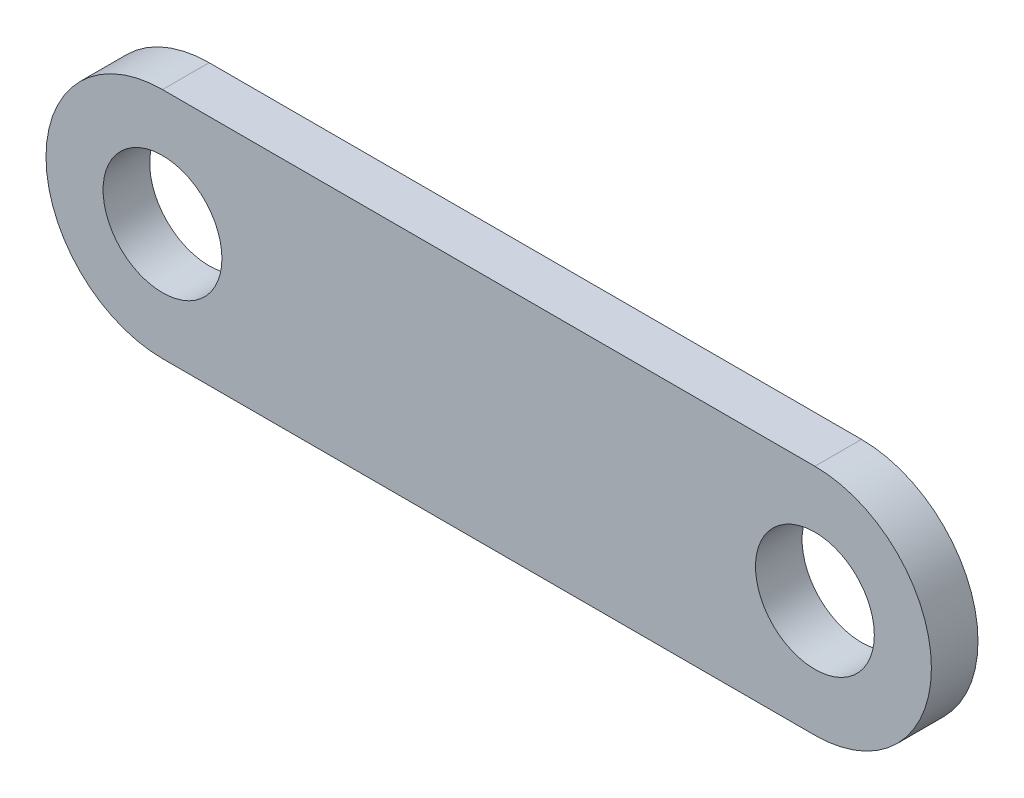
ISO-10303-21;
HEADER;
FILE_DESCRIPTION(('STEP AP214'),'2;1');
FILE_NAME('part.step','',(''),(''),'','','');
FILE_SCHEMA(('AUTOMOTIVE_DESIGN { 1 0 10303 214 1 1 1 1 }'));
ENDSEC;
DATA;
#1=APPLICATION_CONTEXT('core data for automotive mechanical design processes');
#2=APPLICATION_PROTOCOL_DEFINITION('international standard','automotive_design',2000,#1);
#3=PRODUCT_CONTEXT('',#1,'mechanical');
#4=PRODUCT('Part','Part','',(#3));
#5=PRODUCT_RELATED_PRODUCT_CATEGORY('part','',(#4));
#6=PRODUCT_DEFINITION_FORMATION('','',#4);
#7=PRODUCT_DEFINITION_CONTEXT('part definition',#1,'design');
#8=PRODUCT_DEFINITION('design','',#6,#7);
#9=PRODUCT_DEFINITION_SHAPE('','',#8);
#10=(LENGTH_UNIT() NAMED_UNIT(*) SI_UNIT(.MILLI.,.METRE.));
#11=(NAMED_UNIT(*) PLANE_ANGLE_UNIT() SI_UNIT($,.RADIAN.));
#12=(NAMED_UNIT(*) SI_UNIT($,.STERADIAN.) SOLID_ANGLE_UNIT());
#13=UNCERTAINTY_MEASURE_WITH_UNIT(LENGTH_MEASURE(1.E-05),#10,'distance_accuracy_value','');
#14=(GEOMETRIC_REPRESENTATION_CONTEXT(3) GLOBAL_UNCERTAINTY_ASSIGNED_CONTEXT((#13)) GLOBAL_UNIT_ASSIGNED_CONTEXT((#10,
#11,#12)) REPRESENTATION_CONTEXT('',''));
#15=CARTESIAN_POINT('',(0.,0.,0.));
#16=DIRECTION('',(0.,0.,1.));
#17=DIRECTION('',(1.,0.,0.));
#18=AXIS2_PLACEMENT_3D('',#15,#16,#17);
#19=CARTESIAN_POINT('',(-14.,0.,2.));
#20=DIRECTION('',(0.,0.,1.));
#21=DIRECTION('',(1.,0.,0.));
#22=AXIS2_PLACEMENT_3D('',#19,#20,#21);
#23=PLANE('',#22);
#24=CARTESIAN_POINT('',(-14.,0.,2.));
#25=DIRECTION('',(0.,0.,1.));
#26=DIRECTION('',(1.,0.,0.));
#27=AXIS2_PLACEMENT_3D('',#24,#25,#26);
#28=CIRCLE('',#27,2.55);
#29=CARTESIAN_POINT('',(-11.45,0.,2.));
#30=VERTEX_POINT('',#29);
#31=EDGE_CURVE('E102',#30,#30,#28,.T.);
#32=ORIENTED_EDGE('',*,*,#31,.F.);
#33=EDGE_LOOP('',(#32));
#34=FACE_BOUND('',#33,.T.);
#35=CARTESIAN_POINT('',(-14.,0.,2.));
#36=DIRECTION('',(0.,0.,1.));
#37=DIRECTION('',(1.,0.,0.));
#38=AXIS2_PLACEMENT_3D('',#35,#36,#37);
#39=CIRCLE('',#38,5.);
#40=CARTESIAN_POINT('',(-14.,5.,2.));
#41=VERTEX_POINT('',#40);
#42=CARTESIAN_POINT('',(-14.,-5.,2.));
#43=VERTEX_POINT('',#42);
#44=EDGE_CURVE('E87',#41,#43,#39,.T.);
#45=ORIENTED_EDGE('',*,*,#44,.T.);
#46=DIRECTION('',(1.,0.,0.));
#47=VECTOR('',#46,1.);
#48=CARTESIAN_POINT('',(-14.,-5.,2.));
#49=LINE('',#48,#47);
#50=CARTESIAN_POINT('',(14.,-5.,2.));
#51=VERTEX_POINT('',#50);
#52=EDGE_CURVE('E82',#43,#51,#49,.T.);
#53=ORIENTED_EDGE('',*,*,#52,.T.);
#54=CARTESIAN_POINT('',(14.,0.,2.));
#55=DIRECTION('',(0.,0.,1.));
#56=DIRECTION('',(1.,0.,0.));
#57=AXIS2_PLACEMENT_3D('',#54,#55,#56);
#58=CIRCLE('',#57,5.);
#59=CARTESIAN_POINT('',(14.,5.00000000000001,2.));
#60=VERTEX_POINT('',#59);
#61=EDGE_CURVE('E85',#51,#60,#58,.T.);
#62=ORIENTED_EDGE('',*,*,#61,.T.);
#63=DIRECTION('',(-1.,0.,0.));
#64=VECTOR('',#63,1.);
#65=CARTESIAN_POINT('',(-14.,5.,2.));
#66=LINE('',#65,#64);
#67=EDGE_CURVE('E52',#60,#41,#66,.T.);
#68=ORIENTED_EDGE('',*,*,#67,.T.);
#69=EDGE_LOOP('',(#45,#53,#62,#68));
#70=FACE_BOUND('',#69,.T.);
#71=CARTESIAN_POINT('',(14.,0.,2.));
#72=DIRECTION('',(0.,0.,1.));
#73=DIRECTION('',(1.,0.,0.));
#74=AXIS2_PLACEMENT_3D('',#71,#72,#73);
#75=CIRCLE('',#74,2.55);
#76=CARTESIAN_POINT('',(16.55,0.,2.));
#77=VERTEX_POINT('',#76);
#78=EDGE_CURVE('E117',#77,#77,#75,.T.);
#79=ORIENTED_EDGE('',*,*,#78,.F.);
#80=EDGE_LOOP('',(#79));
#81=FACE_BOUND('',#80,.T.);
#82=ADVANCED_FACE('F35',(#34,#70,#81),#23,.T.);
#83=CARTESIAN_POINT('',(-14.,0.,0.));
#84=DIRECTION('',(0.,0.,1.));
#85=DIRECTION('',(1.,0.,0.));
#86=AXIS2_PLACEMENT_3D('',#83,#84,#85);
#87=PLANE('',#86);
#88=CARTESIAN_POINT('',(-14.,0.,0.));
#89=DIRECTION('',(0.,0.,1.));
#90=DIRECTION('',(1.,0.,0.));
#91=AXIS2_PLACEMENT_3D('',#88,#89,#90);
#92=CIRCLE('',#91,5.);
#93=CARTESIAN_POINT('',(-14.,5.,0.));
#94=VERTEX_POINT('',#93);
#95=CARTESIAN_POINT('',(-14.,-5.,0.));
#96=VERTEX_POINT('',#95);
#97=EDGE_CURVE('E99',#94,#96,#92,.T.);
#98=ORIENTED_EDGE('',*,*,#97,.F.);
#99=DIRECTION('',(-1.,0.,0.));
#100=VECTOR('',#99,1.);
#101=CARTESIAN_POINT('',(-14.,5.,0.));
#102=LINE('',#101,#100);
#103=CARTESIAN_POINT('',(14.,5.00000000000001,0.));
#104=VERTEX_POINT('',#103);
#105=EDGE_CURVE('E75',#104,#94,#102,.T.);
#106=ORIENTED_EDGE('',*,*,#105,.F.);
#107=CARTESIAN_POINT('',(14.,0.,0.));
#108=DIRECTION('',(0.,0.,1.));
#109=DIRECTION('',(1.,0.,0.));
#110=AXIS2_PLACEMENT_3D('',#107,#108,#109);
#111=CIRCLE('',#110,5.);
#112=CARTESIAN_POINT('',(14.,-5.,0.));
#113=VERTEX_POINT('',#112);
#114=EDGE_CURVE('E69',#113,#104,#111,.T.);
#115=ORIENTED_EDGE('',*,*,#114,.F.);
#116=DIRECTION('',(1.,0.,0.));
#117=VECTOR('',#116,1.);
#118=CARTESIAN_POINT('',(-14.,-5.,0.));
#119=LINE('',#118,#117);
#120=EDGE_CURVE('E91',#96,#113,#119,.T.);
#121=ORIENTED_EDGE('',*,*,#120,.F.);
#122=EDGE_LOOP('',(#98,#106,#115,#121));
#123=FACE_BOUND('',#122,.T.);
#124=CARTESIAN_POINT('',(-14.,0.,0.));
#125=DIRECTION('',(0.,0.,1.));
#126=DIRECTION('',(1.,0.,0.));
#127=AXIS2_PLACEMENT_3D('',#124,#125,#126);
#128=CIRCLE('',#127,2.55);
#129=CARTESIAN_POINT('',(-11.45,0.,0.));
#130=VERTEX_POINT('',#129);
#131=EDGE_CURVE('E114',#130,#130,#128,.T.);
#132=ORIENTED_EDGE('',*,*,#131,.T.);
#133=EDGE_LOOP('',(#132));
#134=FACE_BOUND('',#133,.T.);
#135=CARTESIAN_POINT('',(14.,0.,0.));
#136=DIRECTION('',(0.,0.,1.));
#137=DIRECTION('',(1.,0.,0.));
#138=AXIS2_PLACEMENT_3D('',#135,#136,#137);
#139=CIRCLE('',#138,2.55);
#140=CARTESIAN_POINT('',(16.55,0.,0.));
#141=VERTEX_POINT('',#140);
#142=EDGE_CURVE('E120',#141,#141,#139,.T.);
#143=ORIENTED_EDGE('',*,*,#142,.T.);
#144=EDGE_LOOP('',(#143));
#145=FACE_BOUND('',#144,.T.);
#146=ADVANCED_FACE('F110',(#123,#134,#145),#87,.F.);
#147=CARTESIAN_POINT('',(-14.,0.,2.));
#148=DIRECTION('',(0.,0.,-1.));
#149=DIRECTION('',(-1.,0.,0.));
#150=AXIS2_PLACEMENT_3D('',#147,#148,#149);
#151=CYLINDRICAL_SURFACE('',#150,5.);
#152=ORIENTED_EDGE('',*,*,#97,.T.);
#153=DIRECTION('',(0.,0.,-1.));
#154=VECTOR('',#153,1.);
#155=CARTESIAN_POINT('',(-14.,-5.,2.));
#156=LINE('',#155,#154);
#157=EDGE_CURVE('E11',#43,#96,#156,.T.);
#158=ORIENTED_EDGE('',*,*,#157,.F.);
#159=ORIENTED_EDGE('',*,*,#44,.F.);
#160=DIRECTION('',(0.,0.,-1.));
#161=VECTOR('',#160,1.);
#162=CARTESIAN_POINT('',(-14.,5.,2.));
#163=LINE('',#162,#161);
#164=EDGE_CURVE('E95',#41,#94,#163,.T.);
#165=ORIENTED_EDGE('',*,*,#164,.T.);
#166=EDGE_LOOP('',(#152,#158,#159,#165));
#167=FACE_BOUND('',#166,.T.);
#168=ADVANCED_FACE('F37',(#167),#151,.T.);
#169=CARTESIAN_POINT('',(-14.,-5.,2.));
#170=DIRECTION('',(0.,1.,0.));
#171=DIRECTION('',(-1.,0.,0.));
#172=AXIS2_PLACEMENT_3D('',#169,#170,#171);
#173=PLANE('',#172);
#174=ORIENTED_EDGE('',*,*,#120,.T.);
#175=DIRECTION('',(0.,0.,-1.));
#176=VECTOR('',#175,1.);
#177=CARTESIAN_POINT('',(14.,-5.,2.));
#178=LINE('',#177,#176);
#179=EDGE_CURVE('E44',#51,#113,#178,.T.);
#180=ORIENTED_EDGE('',*,*,#179,.F.);
#181=ORIENTED_EDGE('',*,*,#52,.F.);
#182=ORIENTED_EDGE('',*,*,#157,.T.);
#183=EDGE_LOOP('',(#174,#180,#181,#182));
#184=FACE_BOUND('',#183,.T.);
#185=ADVANCED_FACE('F90',(#184),#173,.F.);
#186=CARTESIAN_POINT('',(14.,0.,2.));
#187=DIRECTION('',(0.,0.,-1.));
#188=DIRECTION('',(-1.,0.,0.));
#189=AXIS2_PLACEMENT_3D('',#186,#187,#188);
#190=CYLINDRICAL_SURFACE('',#189,5.);
#191=ORIENTED_EDGE('',*,*,#114,.T.);
#192=DIRECTION('',(0.,0.,-1.));
#193=VECTOR('',#192,1.);
#194=CARTESIAN_POINT('',(14.,5.00000000000001,2.));
#195=LINE('',#194,#193);
#196=EDGE_CURVE('E92',#60,#104,#195,.T.);
#197=ORIENTED_EDGE('',*,*,#196,.F.);
#198=ORIENTED_EDGE('',*,*,#61,.F.);
#199=ORIENTED_EDGE('',*,*,#179,.T.);
#200=EDGE_LOOP('',(#191,#197,#198,#199));
#201=FACE_BOUND('',#200,.T.);
#202=ADVANCED_FACE('F93',(#201),#190,.T.);
#203=CARTESIAN_POINT('',(-14.,5.,2.));
#204=DIRECTION('',(0.,-1.,0.));
#205=DIRECTION('',(1.,0.,0.));
#206=AXIS2_PLACEMENT_3D('',#203,#204,#205);
#207=PLANE('',#206);
#208=ORIENTED_EDGE('',*,*,#105,.T.);
#209=ORIENTED_EDGE('',*,*,#164,.F.);
#210=ORIENTED_EDGE('',*,*,#67,.F.);
#211=ORIENTED_EDGE('',*,*,#196,.T.);
#212=EDGE_LOOP('',(#208,#209,#210,#211));
#213=FACE_BOUND('',#212,.T.);
#214=ADVANCED_FACE('F107',(#213),#207,.F.);
#215=CARTESIAN_POINT('',(-14.,0.,2.));
#216=DIRECTION('',(0.,0.,-1.));
#217=DIRECTION('',(-1.,0.,0.));
#218=AXIS2_PLACEMENT_3D('',#215,#216,#217);
#219=CYLINDRICAL_SURFACE('',#218,2.55);
#220=ORIENTED_EDGE('',*,*,#31,.T.);
#221=EDGE_LOOP('',(#220));
#222=FACE_BOUND('',#221,.T.);
#223=ORIENTED_EDGE('',*,*,#131,.F.);
#224=EDGE_LOOP('',(#223));
#225=FACE_BOUND('',#224,.T.);
#226=ADVANCED_FACE('F137',(#222,#225),#219,.F.);
#227=CARTESIAN_POINT('',(14.,0.,2.));
#228=DIRECTION('',(0.,0.,-1.));
#229=DIRECTION('',(-1.,0.,0.));
#230=AXIS2_PLACEMENT_3D('',#227,#228,#229);
#231=CYLINDRICAL_SURFACE('',#230,2.55);
#232=ORIENTED_EDGE('',*,*,#78,.T.);
#233=EDGE_LOOP('',(#232));
#234=FACE_BOUND('',#233,.T.);
#235=ORIENTED_EDGE('',*,*,#142,.F.);
#236=EDGE_LOOP('',(#235));
#237=FACE_BOUND('',#236,.T.);
#238=ADVANCED_FACE('F126',(#234,#237),#231,.F.);
#239=CLOSED_SHELL('',(#82,#146,#168,#185,#202,#214,#226,#238));
#240=MANIFOLD_SOLID_BREP('B2',#239);
#241=ADVANCED_BREP_SHAPE_REPRESENTATION('',(#18,#240),#14);
#242=SHAPE_DEFINITION_REPRESENTATION(#9,#241);
ENDSEC;
END-ISO-10303-21;
